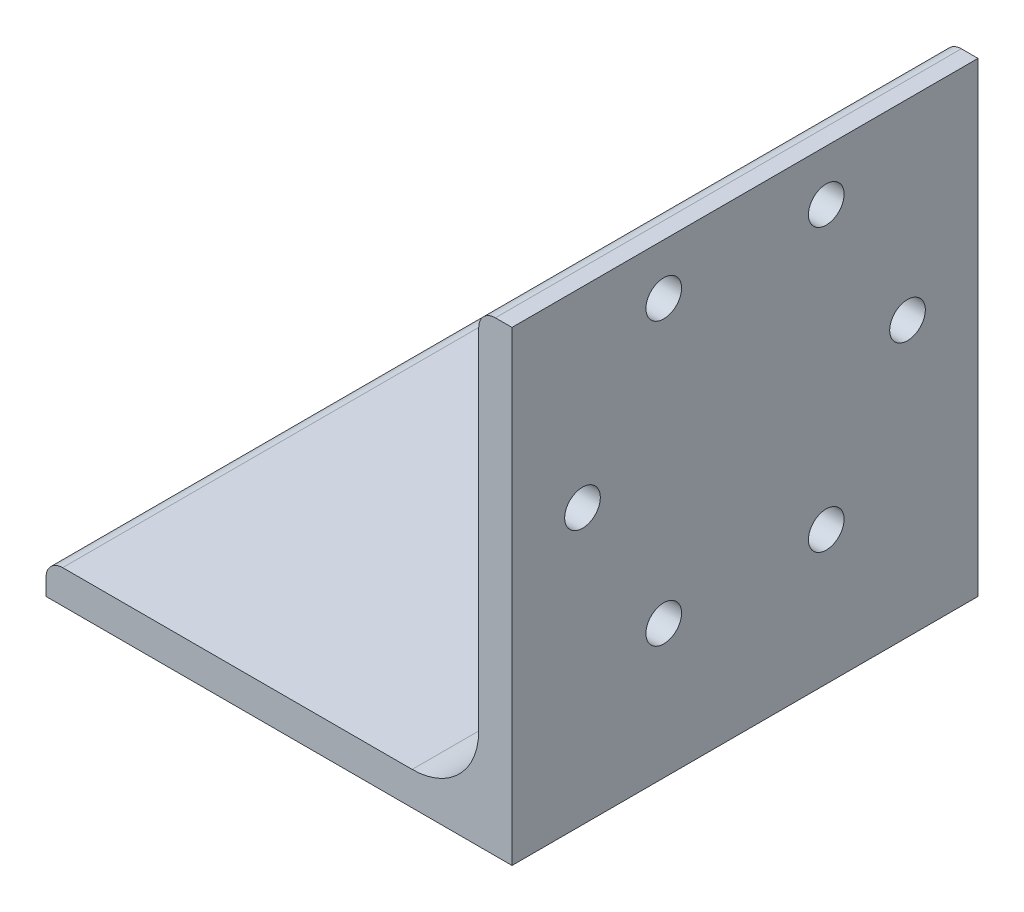
ISO-10303-21;
HEADER;
FILE_DESCRIPTION(('STEP AP214'),'2;1');
FILE_NAME('part.step','',(''),(''),'','','');
FILE_SCHEMA(('AUTOMOTIVE_DESIGN { 1 0 10303 214 1 1 1 1 }'));
ENDSEC;
DATA;
#1=APPLICATION_CONTEXT('core data for automotive mechanical design processes');
#2=APPLICATION_PROTOCOL_DEFINITION('international standard','automotive_design',2000,#1);
#3=PRODUCT_CONTEXT('',#1,'mechanical');
#4=PRODUCT('Part','Part','',(#3));
#5=PRODUCT_RELATED_PRODUCT_CATEGORY('part','',(#4));
#6=PRODUCT_DEFINITION_FORMATION('','',#4);
#7=PRODUCT_DEFINITION_CONTEXT('part definition',#1,'design');
#8=PRODUCT_DEFINITION('design','',#6,#7);
#9=PRODUCT_DEFINITION_SHAPE('','',#8);
#10=(LENGTH_UNIT() NAMED_UNIT(*) SI_UNIT(.MILLI.,.METRE.));
#11=(NAMED_UNIT(*) PLANE_ANGLE_UNIT() SI_UNIT($,.RADIAN.));
#12=(NAMED_UNIT(*) SI_UNIT($,.STERADIAN.) SOLID_ANGLE_UNIT());
#13=UNCERTAINTY_MEASURE_WITH_UNIT(LENGTH_MEASURE(1.E-05),#10,'distance_accuracy_value','');
#14=(GEOMETRIC_REPRESENTATION_CONTEXT(3) GLOBAL_UNCERTAINTY_ASSIGNED_CONTEXT((#13)) GLOBAL_UNIT_ASSIGNED_CONTEXT((#10,
#11,#12)) REPRESENTATION_CONTEXT('',''));
#15=CARTESIAN_POINT('',(0.,0.,0.));
#16=DIRECTION('',(0.,0.,1.));
#17=DIRECTION('',(1.,0.,0.));
#18=AXIS2_PLACEMENT_3D('',#15,#16,#17);
#19=CARTESIAN_POINT('',(-22.225,1.5875,22.225));
#20=DIRECTION('',(1.,0.,0.));
#21=DIRECTION('',(0.,0.,-1.));
#22=AXIS2_PLACEMENT_3D('',#19,#20,#21);
#23=PLANE('',#22);
#24=DIRECTION('',(0.,-1.,0.));
#25=VECTOR('',#24,1.);
#26=CARTESIAN_POINT('',(-22.225,1.5875,-22.225));
#27=LINE('',#26,#25);
#28=CARTESIAN_POINT('',(-22.225,1.5875,-22.225));
#29=VERTEX_POINT('',#28);
#30=CARTESIAN_POINT('',(-22.225,0.,-22.225));
#31=VERTEX_POINT('',#30);
#32=EDGE_CURVE('E146',#29,#31,#27,.T.);
#33=ORIENTED_EDGE('',*,*,#32,.T.);
#34=DIRECTION('',(0.,0.,-1.));
#35=VECTOR('',#34,1.);
#36=CARTESIAN_POINT('',(-22.225,0.,22.225));
#37=LINE('',#36,#35);
#38=CARTESIAN_POINT('',(-22.225,0.,22.225));
#39=VERTEX_POINT('',#38);
#40=EDGE_CURVE('E11',#39,#31,#37,.T.);
#41=ORIENTED_EDGE('',*,*,#40,.F.);
#42=DIRECTION('',(0.,-1.,0.));
#43=VECTOR('',#42,1.);
#44=CARTESIAN_POINT('',(-22.225,1.5875,22.225));
#45=LINE('',#44,#43);
#46=CARTESIAN_POINT('',(-22.225,1.5875,22.225));
#47=VERTEX_POINT('',#46);
#48=EDGE_CURVE('E172',#47,#39,#45,.T.);
#49=ORIENTED_EDGE('',*,*,#48,.F.);
#50=DIRECTION('',(0.,0.,-1.));
#51=VECTOR('',#50,1.);
#52=CARTESIAN_POINT('',(-22.225,1.5875,22.225));
#53=LINE('',#52,#51);
#54=EDGE_CURVE('E142',#47,#29,#53,.T.);
#55=ORIENTED_EDGE('',*,*,#54,.T.);
#56=EDGE_LOOP('',(#33,#41,#49,#55));
#57=FACE_BOUND('',#56,.T.);
#58=ADVANCED_FACE('F39',(#57),#23,.F.);
#59=CARTESIAN_POINT('',(-22.225,0.,22.225));
#60=DIRECTION('',(0.,1.,0.));
#61=DIRECTION('',(0.,0.,1.));
#62=AXIS2_PLACEMENT_3D('',#59,#60,#61);
#63=PLANE('',#62);
#64=DIRECTION('',(1.,0.,0.));
#65=VECTOR('',#64,1.);
#66=CARTESIAN_POINT('',(-22.225,0.,-22.225));
#67=LINE('',#66,#65);
#68=CARTESIAN_POINT('',(22.225,0.,-22.225));
#69=VERTEX_POINT('',#68);
#70=EDGE_CURVE('E150',#31,#69,#67,.T.);
#71=ORIENTED_EDGE('',*,*,#70,.T.);
#72=DIRECTION('',(0.,0.,-1.));
#73=VECTOR('',#72,1.);
#74=CARTESIAN_POINT('',(22.225,0.,22.225));
#75=LINE('',#74,#73);
#76=CARTESIAN_POINT('',(22.225,0.,22.225));
#77=VERTEX_POINT('',#76);
#78=EDGE_CURVE('E48',#77,#69,#75,.T.);
#79=ORIENTED_EDGE('',*,*,#78,.F.);
#80=DIRECTION('',(1.,0.,0.));
#81=VECTOR('',#80,1.);
#82=CARTESIAN_POINT('',(-22.225,0.,22.225));
#83=LINE('',#82,#81);
#84=EDGE_CURVE('E102',#39,#77,#83,.T.);
#85=ORIENTED_EDGE('',*,*,#84,.F.);
#86=ORIENTED_EDGE('',*,*,#40,.T.);
#87=EDGE_LOOP('',(#71,#79,#85,#86));
#88=FACE_BOUND('',#87,.T.);
#89=ADVANCED_FACE('F304',(#88),#63,.F.);
#90=CARTESIAN_POINT('',(22.225,0.,22.225));
#91=DIRECTION('',(-1.,0.,0.));
#92=DIRECTION('',(0.,0.,1.));
#93=AXIS2_PLACEMENT_3D('',#90,#91,#92);
#94=PLANE('',#93);
#95=CARTESIAN_POINT('',(22.225,26.19375,15.5));
#96=DIRECTION('',(-1.,0.,0.));
#97=DIRECTION('',(0.,0.,1.));
#98=AXIS2_PLACEMENT_3D('',#95,#96,#97);
#99=CIRCLE('',#98,1.7);
#100=CARTESIAN_POINT('',(22.225,26.19375,17.2));
#101=VERTEX_POINT('',#100);
#102=EDGE_CURVE('E265',#101,#101,#99,.T.);
#103=ORIENTED_EDGE('',*,*,#102,.T.);
#104=EDGE_LOOP('',(#103));
#105=FACE_BOUND('',#104,.T.);
#106=CARTESIAN_POINT('',(22.225,39.6171437586588,7.75));
#107=DIRECTION('',(-1.,0.,0.));
#108=DIRECTION('',(0.,0.,1.));
#109=AXIS2_PLACEMENT_3D('',#106,#107,#108);
#110=CIRCLE('',#109,1.7);
#111=CARTESIAN_POINT('',(22.225,39.6171437586588,9.45));
#112=VERTEX_POINT('',#111);
#113=EDGE_CURVE('E257',#112,#112,#110,.T.);
#114=ORIENTED_EDGE('',*,*,#113,.T.);
#115=EDGE_LOOP('',(#114));
#116=FACE_BOUND('',#115,.T.);
#117=CARTESIAN_POINT('',(22.225,39.6171437586588,-7.74999999999999));
#118=DIRECTION('',(-1.,0.,0.));
#119=DIRECTION('',(0.,0.,1.));
#120=AXIS2_PLACEMENT_3D('',#117,#118,#119);
#121=CIRCLE('',#120,1.7);
#122=CARTESIAN_POINT('',(22.225,39.6171437586588,-6.04999999999999));
#123=VERTEX_POINT('',#122);
#124=EDGE_CURVE('E249',#123,#123,#121,.T.);
#125=ORIENTED_EDGE('',*,*,#124,.T.);
#126=EDGE_LOOP('',(#125));
#127=FACE_BOUND('',#126,.T.);
#128=CARTESIAN_POINT('',(22.225,26.19375,-15.5));
#129=DIRECTION('',(-1.,0.,0.));
#130=DIRECTION('',(0.,0.,1.));
#131=AXIS2_PLACEMENT_3D('',#128,#129,#130);
#132=CIRCLE('',#131,1.7);
#133=CARTESIAN_POINT('',(22.225,26.19375,-13.8));
#134=VERTEX_POINT('',#133);
#135=EDGE_CURVE('E241',#134,#134,#132,.T.);
#136=ORIENTED_EDGE('',*,*,#135,.T.);
#137=EDGE_LOOP('',(#136));
#138=FACE_BOUND('',#137,.T.);
#139=CARTESIAN_POINT('',(22.225,12.7703562413412,-7.74999999999999));
#140=DIRECTION('',(-1.,0.,0.));
#141=DIRECTION('',(0.,0.,1.));
#142=AXIS2_PLACEMENT_3D('',#139,#140,#141);
#143=CIRCLE('',#142,1.7);
#144=CARTESIAN_POINT('',(22.225,12.7703562413412,-6.05));
#145=VERTEX_POINT('',#144);
#146=EDGE_CURVE('E233',#145,#145,#143,.T.);
#147=ORIENTED_EDGE('',*,*,#146,.T.);
#148=EDGE_LOOP('',(#147));
#149=FACE_BOUND('',#148,.T.);
#150=CARTESIAN_POINT('',(22.225,12.7703562413412,7.75));
#151=DIRECTION('',(-1.,0.,0.));
#152=DIRECTION('',(0.,0.,1.));
#153=AXIS2_PLACEMENT_3D('',#150,#151,#152);
#154=CIRCLE('',#153,1.7);
#155=CARTESIAN_POINT('',(22.225,12.7703562413412,9.45));
#156=VERTEX_POINT('',#155);
#157=EDGE_CURVE('E151',#156,#156,#154,.T.);
#158=ORIENTED_EDGE('',*,*,#157,.T.);
#159=EDGE_LOOP('',(#158));
#160=FACE_BOUND('',#159,.T.);
#161=DIRECTION('',(0.,1.,0.));
#162=VECTOR('',#161,1.);
#163=CARTESIAN_POINT('',(22.225,0.,-22.225));
#164=LINE('',#163,#162);
#165=CARTESIAN_POINT('',(22.225,44.45,-22.225));
#166=VERTEX_POINT('',#165);
#167=EDGE_CURVE('E154',#69,#166,#164,.T.);
#168=ORIENTED_EDGE('',*,*,#167,.T.);
#169=DIRECTION('',(0.,0.,-1.));
#170=VECTOR('',#169,1.);
#171=CARTESIAN_POINT('',(22.225,44.45,22.225));
#172=LINE('',#171,#170);
#173=CARTESIAN_POINT('',(22.225,44.45,22.225));
#174=VERTEX_POINT('',#173);
#175=EDGE_CURVE('E187',#174,#166,#172,.T.);
#176=ORIENTED_EDGE('',*,*,#175,.F.);
#177=DIRECTION('',(0.,1.,0.));
#178=VECTOR('',#177,1.);
#179=CARTESIAN_POINT('',(22.225,0.,22.225));
#180=LINE('',#179,#178);
#181=EDGE_CURVE('E197',#77,#174,#180,.T.);
#182=ORIENTED_EDGE('',*,*,#181,.F.);
#183=ORIENTED_EDGE('',*,*,#78,.T.);
#184=EDGE_LOOP('',(#168,#176,#182,#183));
#185=FACE_BOUND('',#184,.T.);
#186=ADVANCED_FACE('F195',(#105,#116,#127,#138,#149,#160,#185),#94,.F.);
#187=CARTESIAN_POINT('',(20.6375,44.45,22.225));
#188=DIRECTION('',(0.,-1.,0.));
#189=DIRECTION('',(0.,0.,-1.));
#190=AXIS2_PLACEMENT_3D('',#187,#188,#189);
#191=PLANE('',#190);
#192=DIRECTION('',(-1.,0.,0.));
#193=VECTOR('',#192,1.);
#194=CARTESIAN_POINT('',(20.6375,44.45,-22.225));
#195=LINE('',#194,#193);
#196=CARTESIAN_POINT('',(20.6375,44.45,-22.225));
#197=VERTEX_POINT('',#196);
#198=EDGE_CURVE('E157',#166,#197,#195,.T.);
#199=ORIENTED_EDGE('',*,*,#198,.T.);
#200=DIRECTION('',(0.,0.,-1.));
#201=VECTOR('',#200,1.);
#202=CARTESIAN_POINT('',(20.6375,44.45,22.225));
#203=LINE('',#202,#201);
#204=CARTESIAN_POINT('',(20.6375,44.45,22.225));
#205=VERTEX_POINT('',#204);
#206=EDGE_CURVE('E183',#205,#197,#203,.T.);
#207=ORIENTED_EDGE('',*,*,#206,.F.);
#208=DIRECTION('',(-1.,0.,0.));
#209=VECTOR('',#208,1.);
#210=CARTESIAN_POINT('',(20.6375,44.45,22.225));
#211=LINE('',#210,#209);
#212=EDGE_CURVE('E214',#174,#205,#211,.T.);
#213=ORIENTED_EDGE('',*,*,#212,.F.);
#214=ORIENTED_EDGE('',*,*,#175,.T.);
#215=EDGE_LOOP('',(#199,#207,#213,#214));
#216=FACE_BOUND('',#215,.T.);
#217=ADVANCED_FACE('F206',(#216),#191,.F.);
#218=CARTESIAN_POINT('',(20.6375,42.8625,22.225));
#219=DIRECTION('',(0.,0.,-1.));
#220=DIRECTION('',(-1.,0.,0.));
#221=AXIS2_PLACEMENT_3D('',#218,#219,#220);
#222=CYLINDRICAL_SURFACE('',#221,1.5875);
#223=CARTESIAN_POINT('',(20.6375,42.8625,-22.225));
#224=DIRECTION('',(0.,0.,1.));
#225=DIRECTION('',(-1.,0.,0.));
#226=AXIS2_PLACEMENT_3D('',#223,#224,#225);
#227=CIRCLE('',#226,1.5875);
#228=CARTESIAN_POINT('',(19.05,42.8625,-22.225));
#229=VERTEX_POINT('',#228);
#230=EDGE_CURVE('E160',#197,#229,#227,.T.);
#231=ORIENTED_EDGE('',*,*,#230,.T.);
#232=DIRECTION('',(0.,0.,-1.));
#233=VECTOR('',#232,1.);
#234=CARTESIAN_POINT('',(19.05,42.8625,22.225));
#235=LINE('',#234,#233);
#236=CARTESIAN_POINT('',(19.05,42.8625,22.225));
#237=VERTEX_POINT('',#236);
#238=EDGE_CURVE('E179',#237,#229,#235,.T.);
#239=ORIENTED_EDGE('',*,*,#238,.F.);
#240=CARTESIAN_POINT('',(20.6375,42.8625,22.225));
#241=DIRECTION('',(0.,0.,1.));
#242=DIRECTION('',(-1.,0.,0.));
#243=AXIS2_PLACEMENT_3D('',#240,#241,#242);
#244=CIRCLE('',#243,1.5875);
#245=EDGE_CURVE('E212',#205,#237,#244,.T.);
#246=ORIENTED_EDGE('',*,*,#245,.F.);
#247=ORIENTED_EDGE('',*,*,#206,.T.);
#248=EDGE_LOOP('',(#231,#239,#246,#247));
#249=FACE_BOUND('',#248,.T.);
#250=ADVANCED_FACE('F210',(#249),#222,.T.);
#251=CARTESIAN_POINT('',(19.05,42.8625,22.225));
#252=DIRECTION('',(1.,0.,0.));
#253=DIRECTION('',(0.,1.,0.));
#254=AXIS2_PLACEMENT_3D('',#251,#252,#253);
#255=PLANE('',#254);
#256=CARTESIAN_POINT('',(19.05,26.19375,15.5));
#257=DIRECTION('',(-1.,0.,0.));
#258=DIRECTION('',(0.,0.,1.));
#259=AXIS2_PLACEMENT_3D('',#256,#257,#258);
#260=CIRCLE('',#259,1.69999999999999);
#261=CARTESIAN_POINT('',(19.05,26.19375,17.2));
#262=VERTEX_POINT('',#261);
#263=EDGE_CURVE('E269',#262,#262,#260,.T.);
#264=ORIENTED_EDGE('',*,*,#263,.F.);
#265=EDGE_LOOP('',(#264));
#266=FACE_BOUND('',#265,.T.);
#267=CARTESIAN_POINT('',(19.05,39.6171437586588,7.75));
#268=DIRECTION('',(-1.,0.,0.));
#269=DIRECTION('',(0.,0.,1.));
#270=AXIS2_PLACEMENT_3D('',#267,#268,#269);
#271=CIRCLE('',#270,1.69999999999999);
#272=CARTESIAN_POINT('',(19.05,39.6171437586588,9.44999999999998));
#273=VERTEX_POINT('',#272);
#274=EDGE_CURVE('E261',#273,#273,#271,.T.);
#275=ORIENTED_EDGE('',*,*,#274,.F.);
#276=EDGE_LOOP('',(#275));
#277=FACE_BOUND('',#276,.T.);
#278=CARTESIAN_POINT('',(19.05,39.6171437586588,-7.74999999999999));
#279=DIRECTION('',(-1.,0.,0.));
#280=DIRECTION('',(0.,0.,1.));
#281=AXIS2_PLACEMENT_3D('',#278,#279,#280);
#282=CIRCLE('',#281,1.69999999999999);
#283=CARTESIAN_POINT('',(19.05,39.6171437586588,-6.05));
#284=VERTEX_POINT('',#283);
#285=EDGE_CURVE('E253',#284,#284,#282,.T.);
#286=ORIENTED_EDGE('',*,*,#285,.F.);
#287=EDGE_LOOP('',(#286));
#288=FACE_BOUND('',#287,.T.);
#289=CARTESIAN_POINT('',(19.05,26.19375,-15.5));
#290=DIRECTION('',(-1.,0.,0.));
#291=DIRECTION('',(0.,0.,1.));
#292=AXIS2_PLACEMENT_3D('',#289,#290,#291);
#293=CIRCLE('',#292,1.69999999999999);
#294=CARTESIAN_POINT('',(19.05,26.19375,-13.8));
#295=VERTEX_POINT('',#294);
#296=EDGE_CURVE('E245',#295,#295,#293,.T.);
#297=ORIENTED_EDGE('',*,*,#296,.F.);
#298=EDGE_LOOP('',(#297));
#299=FACE_BOUND('',#298,.T.);
#300=CARTESIAN_POINT('',(19.05,12.7703562413412,-7.74999999999999));
#301=DIRECTION('',(-1.,0.,0.));
#302=DIRECTION('',(0.,0.,1.));
#303=AXIS2_PLACEMENT_3D('',#300,#301,#302);
#304=CIRCLE('',#303,1.69999999999999);
#305=CARTESIAN_POINT('',(19.05,12.7703562413412,-6.05000000000001));
#306=VERTEX_POINT('',#305);
#307=EDGE_CURVE('E237',#306,#306,#304,.T.);
#308=ORIENTED_EDGE('',*,*,#307,.F.);
#309=EDGE_LOOP('',(#308));
#310=FACE_BOUND('',#309,.T.);
#311=CARTESIAN_POINT('',(19.05,12.7703562413412,7.75));
#312=DIRECTION('',(-1.,0.,0.));
#313=DIRECTION('',(0.,0.,1.));
#314=AXIS2_PLACEMENT_3D('',#311,#312,#313);
#315=CIRCLE('',#314,1.69999999999999);
#316=CARTESIAN_POINT('',(19.05,12.7703562413412,9.44999999999999));
#317=VERTEX_POINT('',#316);
#318=EDGE_CURVE('E229',#317,#317,#315,.T.);
#319=ORIENTED_EDGE('',*,*,#318,.F.);
#320=EDGE_LOOP('',(#319));
#321=FACE_BOUND('',#320,.T.);
#322=DIRECTION('',(0.,-1.,0.));
#323=VECTOR('',#322,1.);
#324=CARTESIAN_POINT('',(19.05,42.8625,-22.225));
#325=LINE('',#324,#323);
#326=CARTESIAN_POINT('',(19.05,9.525,-22.225));
#327=VERTEX_POINT('',#326);
#328=EDGE_CURVE('E163',#229,#327,#325,.T.);
#329=ORIENTED_EDGE('',*,*,#328,.T.);
#330=DIRECTION('',(0.,0.,-1.));
#331=VECTOR('',#330,1.);
#332=CARTESIAN_POINT('',(19.05,9.525,22.225));
#333=LINE('',#332,#331);
#334=CARTESIAN_POINT('',(19.05,9.525,22.225));
#335=VERTEX_POINT('',#334);
#336=EDGE_CURVE('E135',#335,#327,#333,.T.);
#337=ORIENTED_EDGE('',*,*,#336,.F.);
#338=DIRECTION('',(0.,-1.,0.));
#339=VECTOR('',#338,1.);
#340=CARTESIAN_POINT('',(19.05,42.8625,22.225));
#341=LINE('',#340,#339);
#342=EDGE_CURVE('E124',#237,#335,#341,.T.);
#343=ORIENTED_EDGE('',*,*,#342,.F.);
#344=ORIENTED_EDGE('',*,*,#238,.T.);
#345=EDGE_LOOP('',(#329,#337,#343,#344));
#346=FACE_BOUND('',#345,.T.);
#347=ADVANCED_FACE('F276',(#266,#277,#288,#299,#310,#321,#346),#255,.F.);
#348=CARTESIAN_POINT('',(12.7,9.525,22.225));
#349=DIRECTION('',(0.,0.,-1.));
#350=DIRECTION('',(-1.,0.,0.));
#351=AXIS2_PLACEMENT_3D('',#348,#349,#350);
#352=CYLINDRICAL_SURFACE('',#351,6.35);
#353=CARTESIAN_POINT('',(12.7,9.525,-22.225));
#354=DIRECTION('',(0.,0.,-1.));
#355=DIRECTION('',(-1.,0.,0.));
#356=AXIS2_PLACEMENT_3D('',#353,#354,#355);
#357=CIRCLE('',#356,6.35);
#358=CARTESIAN_POINT('',(12.7,3.175,-22.225));
#359=VERTEX_POINT('',#358);
#360=EDGE_CURVE('E133',#327,#359,#357,.T.);
#361=ORIENTED_EDGE('',*,*,#360,.T.);
#362=DIRECTION('',(0.,0.,-1.));
#363=VECTOR('',#362,1.);
#364=CARTESIAN_POINT('',(12.7,3.175,22.225));
#365=LINE('',#364,#363);
#366=CARTESIAN_POINT('',(12.7,3.175,22.225));
#367=VERTEX_POINT('',#366);
#368=EDGE_CURVE('E130',#367,#359,#365,.T.);
#369=ORIENTED_EDGE('',*,*,#368,.F.);
#370=CARTESIAN_POINT('',(12.7,9.525,22.225));
#371=DIRECTION('',(0.,0.,-1.));
#372=DIRECTION('',(-1.,0.,0.));
#373=AXIS2_PLACEMENT_3D('',#370,#371,#372);
#374=CIRCLE('',#373,6.35);
#375=EDGE_CURVE('E118',#335,#367,#374,.T.);
#376=ORIENTED_EDGE('',*,*,#375,.F.);
#377=ORIENTED_EDGE('',*,*,#336,.T.);
#378=EDGE_LOOP('',(#361,#369,#376,#377));
#379=FACE_BOUND('',#378,.T.);
#380=ADVANCED_FACE('F131',(#379),#352,.F.);
#381=CARTESIAN_POINT('',(12.7,3.175,22.225));
#382=DIRECTION('',(0.,-1.,0.));
#383=DIRECTION('',(1.,0.,0.));
#384=AXIS2_PLACEMENT_3D('',#381,#382,#383);
#385=PLANE('',#384);
#386=DIRECTION('',(-1.,0.,0.));
#387=VECTOR('',#386,1.);
#388=CARTESIAN_POINT('',(12.7,3.175,-22.225));
#389=LINE('',#388,#387);
#390=CARTESIAN_POINT('',(-20.6375,3.175,-22.225));
#391=VERTEX_POINT('',#390);
#392=EDGE_CURVE('E88',#359,#391,#389,.T.);
#393=ORIENTED_EDGE('',*,*,#392,.T.);
#394=DIRECTION('',(0.,0.,-1.));
#395=VECTOR('',#394,1.);
#396=CARTESIAN_POINT('',(-20.6375,3.175,22.225));
#397=LINE('',#396,#395);
#398=CARTESIAN_POINT('',(-20.6375,3.175,22.225));
#399=VERTEX_POINT('',#398);
#400=EDGE_CURVE('E136',#399,#391,#397,.T.);
#401=ORIENTED_EDGE('',*,*,#400,.F.);
#402=DIRECTION('',(-1.,0.,0.));
#403=VECTOR('',#402,1.);
#404=CARTESIAN_POINT('',(12.7,3.175,22.225));
#405=LINE('',#404,#403);
#406=EDGE_CURVE('E122',#367,#399,#405,.T.);
#407=ORIENTED_EDGE('',*,*,#406,.F.);
#408=ORIENTED_EDGE('',*,*,#368,.T.);
#409=EDGE_LOOP('',(#393,#401,#407,#408));
#410=FACE_BOUND('',#409,.T.);
#411=ADVANCED_FACE('F138',(#410),#385,.F.);
#412=CARTESIAN_POINT('',(-20.6375,1.5875,22.225));
#413=DIRECTION('',(0.,0.,-1.));
#414=DIRECTION('',(-1.,0.,0.));
#415=AXIS2_PLACEMENT_3D('',#412,#413,#414);
#416=CYLINDRICAL_SURFACE('',#415,1.5875);
#417=CARTESIAN_POINT('',(-20.6375,1.5875,-22.225));
#418=DIRECTION('',(0.,0.,1.));
#419=DIRECTION('',(-1.,0.,0.));
#420=AXIS2_PLACEMENT_3D('',#417,#418,#419);
#421=CIRCLE('',#420,1.5875);
#422=EDGE_CURVE('E94',#391,#29,#421,.T.);
#423=ORIENTED_EDGE('',*,*,#422,.T.);
#424=ORIENTED_EDGE('',*,*,#54,.F.);
#425=CARTESIAN_POINT('',(-20.6375,1.5875,22.225));
#426=DIRECTION('',(0.,0.,1.));
#427=DIRECTION('',(-1.,0.,0.));
#428=AXIS2_PLACEMENT_3D('',#425,#426,#427);
#429=CIRCLE('',#428,1.5875);
#430=EDGE_CURVE('E56',#399,#47,#429,.T.);
#431=ORIENTED_EDGE('',*,*,#430,.F.);
#432=ORIENTED_EDGE('',*,*,#400,.T.);
#433=EDGE_LOOP('',(#423,#424,#431,#432));
#434=FACE_BOUND('',#433,.T.);
#435=ADVANCED_FACE('F293',(#434),#416,.T.);
#436=CARTESIAN_POINT('',(20.6375,42.8625,22.225));
#437=DIRECTION('',(0.,0.,-1.));
#438=DIRECTION('',(-1.,0.,0.));
#439=AXIS2_PLACEMENT_3D('',#436,#437,#438);
#440=PLANE('',#439);
#441=ORIENTED_EDGE('',*,*,#48,.T.);
#442=ORIENTED_EDGE('',*,*,#84,.T.);
#443=ORIENTED_EDGE('',*,*,#181,.T.);
#444=ORIENTED_EDGE('',*,*,#212,.T.);
#445=ORIENTED_EDGE('',*,*,#245,.T.);
#446=ORIENTED_EDGE('',*,*,#342,.T.);
#447=ORIENTED_EDGE('',*,*,#375,.T.);
#448=ORIENTED_EDGE('',*,*,#406,.T.);
#449=ORIENTED_EDGE('',*,*,#430,.T.);
#450=EDGE_LOOP('',(#441,#442,#443,#444,#445,#446,#447,#448,#449));
#451=FACE_BOUND('',#450,.T.);
#452=ADVANCED_FACE('F120',(#451),#440,.F.);
#453=CARTESIAN_POINT('',(20.6375,42.8625,-22.225));
#454=DIRECTION('',(0.,0.,-1.));
#455=DIRECTION('',(-1.,0.,0.));
#456=AXIS2_PLACEMENT_3D('',#453,#454,#455);
#457=PLANE('',#456);
#458=ORIENTED_EDGE('',*,*,#32,.F.);
#459=ORIENTED_EDGE('',*,*,#422,.F.);
#460=ORIENTED_EDGE('',*,*,#392,.F.);
#461=ORIENTED_EDGE('',*,*,#360,.F.);
#462=ORIENTED_EDGE('',*,*,#328,.F.);
#463=ORIENTED_EDGE('',*,*,#230,.F.);
#464=ORIENTED_EDGE('',*,*,#198,.F.);
#465=ORIENTED_EDGE('',*,*,#167,.F.);
#466=ORIENTED_EDGE('',*,*,#70,.F.);
#467=EDGE_LOOP('',(#458,#459,#460,#461,#462,#463,#464,#465,#466));
#468=FACE_BOUND('',#467,.T.);
#469=ADVANCED_FACE('F201',(#468),#457,.T.);
#470=CARTESIAN_POINT('',(19.05,12.7703562413412,7.75));
#471=DIRECTION('',(-1.,0.,0.));
#472=DIRECTION('',(0.,0.,1.));
#473=AXIS2_PLACEMENT_3D('',#470,#471,#472);
#474=CYLINDRICAL_SURFACE('',#473,1.69999999999999);
#475=ORIENTED_EDGE('',*,*,#157,.F.);
#476=EDGE_LOOP('',(#475));
#477=FACE_BOUND('',#476,.T.);
#478=ORIENTED_EDGE('',*,*,#318,.T.);
#479=EDGE_LOOP('',(#478));
#480=FACE_BOUND('',#479,.T.);
#481=ADVANCED_FACE('F347',(#477,#480),#474,.F.);
#482=CARTESIAN_POINT('',(19.05,12.7703562413412,-7.74999999999999));
#483=DIRECTION('',(-1.,0.,0.));
#484=DIRECTION('',(0.,0.,1.));
#485=AXIS2_PLACEMENT_3D('',#482,#483,#484);
#486=CYLINDRICAL_SURFACE('',#485,1.69999999999999);
#487=ORIENTED_EDGE('',*,*,#146,.F.);
#488=EDGE_LOOP('',(#487));
#489=FACE_BOUND('',#488,.T.);
#490=ORIENTED_EDGE('',*,*,#307,.T.);
#491=EDGE_LOOP('',(#490));
#492=FACE_BOUND('',#491,.T.);
#493=ADVANCED_FACE('F368',(#489,#492),#486,.F.);
#494=CARTESIAN_POINT('',(19.05,26.19375,-15.5));
#495=DIRECTION('',(-1.,0.,0.));
#496=DIRECTION('',(0.,0.,1.));
#497=AXIS2_PLACEMENT_3D('',#494,#495,#496);
#498=CYLINDRICAL_SURFACE('',#497,1.69999999999999);
#499=ORIENTED_EDGE('',*,*,#135,.F.);
#500=EDGE_LOOP('',(#499));
#501=FACE_BOUND('',#500,.T.);
#502=ORIENTED_EDGE('',*,*,#296,.T.);
#503=EDGE_LOOP('',(#502));
#504=FACE_BOUND('',#503,.T.);
#505=ADVANCED_FACE('F378',(#501,#504),#498,.F.);
#506=CARTESIAN_POINT('',(19.05,39.6171437586588,-7.74999999999999));
#507=DIRECTION('',(-1.,0.,0.));
#508=DIRECTION('',(0.,0.,1.));
#509=AXIS2_PLACEMENT_3D('',#506,#507,#508);
#510=CYLINDRICAL_SURFACE('',#509,1.69999999999999);
#511=ORIENTED_EDGE('',*,*,#124,.F.);
#512=EDGE_LOOP('',(#511));
#513=FACE_BOUND('',#512,.T.);
#514=ORIENTED_EDGE('',*,*,#285,.T.);
#515=EDGE_LOOP('',(#514));
#516=FACE_BOUND('',#515,.T.);
#517=ADVANCED_FACE('F388',(#513,#516),#510,.F.);
#518=CARTESIAN_POINT('',(19.05,39.6171437586588,7.75));
#519=DIRECTION('',(-1.,0.,0.));
#520=DIRECTION('',(0.,0.,1.));
#521=AXIS2_PLACEMENT_3D('',#518,#519,#520);
#522=CYLINDRICAL_SURFACE('',#521,1.69999999999999);
#523=ORIENTED_EDGE('',*,*,#113,.F.);
#524=EDGE_LOOP('',(#523));
#525=FACE_BOUND('',#524,.T.);
#526=ORIENTED_EDGE('',*,*,#274,.T.);
#527=EDGE_LOOP('',(#526));
#528=FACE_BOUND('',#527,.T.);
#529=ADVANCED_FACE('F398',(#525,#528),#522,.F.);
#530=CARTESIAN_POINT('',(19.05,26.19375,15.5));
#531=DIRECTION('',(-1.,0.,0.));
#532=DIRECTION('',(0.,0.,1.));
#533=AXIS2_PLACEMENT_3D('',#530,#531,#532);
#534=CYLINDRICAL_SURFACE('',#533,1.69999999999999);
#535=ORIENTED_EDGE('',*,*,#102,.F.);
#536=EDGE_LOOP('',(#535));
#537=FACE_BOUND('',#536,.T.);
#538=ORIENTED_EDGE('',*,*,#263,.T.);
#539=EDGE_LOOP('',(#538));
#540=FACE_BOUND('',#539,.T.);
#541=ADVANCED_FACE('F274',(#537,#540),#534,.F.);
#542=CLOSED_SHELL('',(#58,#89,#186,#217,#250,#347,#380,#411,#435,#452,#469,#481,#493,#505,#517,
#529,#541));
#543=MANIFOLD_SOLID_BREP('B2',#542);
#544=ADVANCED_BREP_SHAPE_REPRESENTATION('',(#18,#543),#14);
#545=SHAPE_DEFINITION_REPRESENTATION(#9,#544);
ENDSEC;
END-ISO-10303-21;
